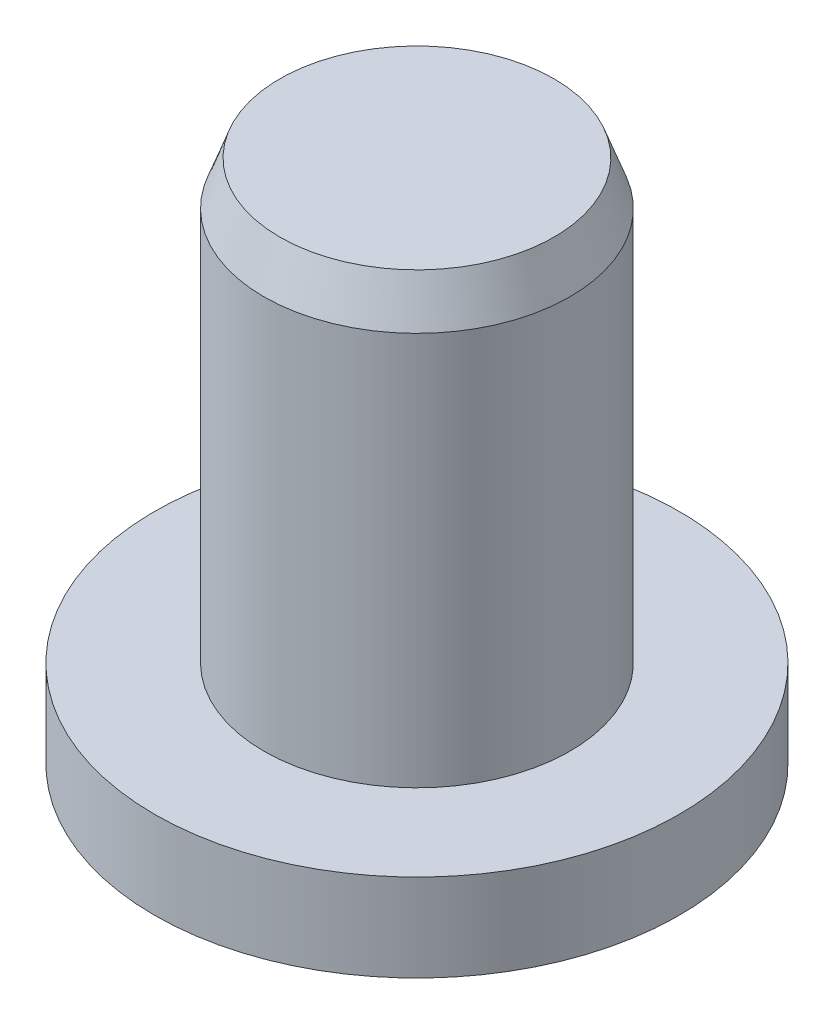
ISO-10303-21;
HEADER;
FILE_DESCRIPTION(('STEP AP214'),'2;1');
FILE_NAME('part.step','',(''),(''),'','','');
FILE_SCHEMA(('AUTOMOTIVE_DESIGN { 1 0 10303 214 1 1 1 1 }'));
ENDSEC;
DATA;
#1=APPLICATION_CONTEXT('core data for automotive mechanical design processes');
#2=APPLICATION_PROTOCOL_DEFINITION('international standard','automotive_design',2000,#1);
#3=PRODUCT_CONTEXT('',#1,'mechanical');
#4=PRODUCT('Part','Part','',(#3));
#5=PRODUCT_RELATED_PRODUCT_CATEGORY('part','',(#4));
#6=PRODUCT_DEFINITION_FORMATION('','',#4);
#7=PRODUCT_DEFINITION_CONTEXT('part definition',#1,'design');
#8=PRODUCT_DEFINITION('design','',#6,#7);
#9=PRODUCT_DEFINITION_SHAPE('','',#8);
#10=(LENGTH_UNIT() NAMED_UNIT(*) SI_UNIT(.MILLI.,.METRE.));
#11=(NAMED_UNIT(*) PLANE_ANGLE_UNIT() SI_UNIT($,.RADIAN.));
#12=(NAMED_UNIT(*) SI_UNIT($,.STERADIAN.) SOLID_ANGLE_UNIT());
#13=UNCERTAINTY_MEASURE_WITH_UNIT(LENGTH_MEASURE(1.E-05),#10,'distance_accuracy_value','');
#14=(GEOMETRIC_REPRESENTATION_CONTEXT(3) GLOBAL_UNCERTAINTY_ASSIGNED_CONTEXT((#13)) GLOBAL_UNIT_ASSIGNED_CONTEXT((#10,
#11,#12)) REPRESENTATION_CONTEXT('',''));
#15=CARTESIAN_POINT('',(0.,0.,0.));
#16=DIRECTION('',(0.,0.,1.));
#17=DIRECTION('',(1.,0.,0.));
#18=AXIS2_PLACEMENT_3D('',#15,#16,#17);
#19=CARTESIAN_POINT('',(0.,2.,0.));
#20=DIRECTION('',(0.,-1.,0.));
#21=DIRECTION('',(0.,0.,-1.));
#22=AXIS2_PLACEMENT_3D('',#19,#20,#21);
#23=CYLINDRICAL_SURFACE('',#22,6.);
#24=CARTESIAN_POINT('',(0.,2.,0.));
#25=DIRECTION('',(0.,1.,0.));
#26=DIRECTION('',(0.,0.,1.));
#27=AXIS2_PLACEMENT_3D('',#24,#25,#26);
#28=CIRCLE('',#27,6.);
#29=CARTESIAN_POINT('',(0.,2.,6.));
#30=VERTEX_POINT('',#29);
#31=EDGE_CURVE('E43',#30,#30,#28,.T.);
#32=ORIENTED_EDGE('',*,*,#31,.F.);
#33=EDGE_LOOP('',(#32));
#34=FACE_BOUND('',#33,.T.);
#35=CARTESIAN_POINT('',(0.,0.,0.));
#36=DIRECTION('',(0.,1.,0.));
#37=DIRECTION('',(0.,0.,1.));
#38=AXIS2_PLACEMENT_3D('',#35,#36,#37);
#39=CIRCLE('',#38,6.);
#40=CARTESIAN_POINT('',(0.,0.,6.));
#41=VERTEX_POINT('',#40);
#42=EDGE_CURVE('E47',#41,#41,#39,.T.);
#43=ORIENTED_EDGE('',*,*,#42,.T.);
#44=EDGE_LOOP('',(#43));
#45=FACE_BOUND('',#44,.T.);
#46=ADVANCED_FACE('F32',(#34,#45),#23,.T.);
#47=CARTESIAN_POINT('',(0.,2.,0.));
#48=DIRECTION('',(0.,1.,0.));
#49=DIRECTION('',(0.,0.,1.));
#50=AXIS2_PLACEMENT_3D('',#47,#48,#49);
#51=PLANE('',#50);
#52=CARTESIAN_POINT('',(0.,2.,0.));
#53=DIRECTION('',(0.,1.,0.));
#54=DIRECTION('',(0.,0.,1.));
#55=AXIS2_PLACEMENT_3D('',#52,#53,#54);
#56=CIRCLE('',#55,3.5);
#57=CARTESIAN_POINT('',(0.,2.,3.5));
#58=VERTEX_POINT('',#57);
#59=EDGE_CURVE('E51',#58,#58,#56,.T.);
#60=ORIENTED_EDGE('',*,*,#59,.F.);
#61=EDGE_LOOP('',(#60));
#62=FACE_BOUND('',#61,.T.);
#63=ORIENTED_EDGE('',*,*,#31,.T.);
#64=EDGE_LOOP('',(#63));
#65=FACE_BOUND('',#64,.T.);
#66=ADVANCED_FACE('F58',(#62,#65),#51,.T.);
#67=CARTESIAN_POINT('',(0.,0.,0.));
#68=DIRECTION('',(0.,1.,0.));
#69=DIRECTION('',(0.,0.,1.));
#70=AXIS2_PLACEMENT_3D('',#67,#68,#69);
#71=PLANE('',#70);
#72=ORIENTED_EDGE('',*,*,#42,.F.);
#73=EDGE_LOOP('',(#72));
#74=FACE_BOUND('',#73,.T.);
#75=ADVANCED_FACE('F61',(#74),#71,.F.);
#76=CARTESIAN_POINT('',(0.,12.,0.));
#77=DIRECTION('',(0.,-1.,0.));
#78=DIRECTION('',(0.,0.,-1.));
#79=AXIS2_PLACEMENT_3D('',#76,#77,#78);
#80=CYLINDRICAL_SURFACE('',#79,3.5);
#81=CARTESIAN_POINT('',(0.,11.,0.));
#82=DIRECTION('',(0.,1.,0.));
#83=DIRECTION('',(0.,0.,1.));
#84=AXIS2_PLACEMENT_3D('',#81,#82,#83);
#85=CIRCLE('',#84,3.5);
#86=CARTESIAN_POINT('',(0.,11.,3.5));
#87=VERTEX_POINT('',#86);
#88=EDGE_CURVE('E10',#87,#87,#85,.F.);
#89=ORIENTED_EDGE('',*,*,#88,.T.);
#90=EDGE_LOOP('',(#89));
#91=FACE_BOUND('',#90,.T.);
#92=ORIENTED_EDGE('',*,*,#59,.T.);
#93=EDGE_LOOP('',(#92));
#94=FACE_BOUND('',#93,.T.);
#95=ADVANCED_FACE('F56',(#91,#94),#80,.T.);
#96=CARTESIAN_POINT('',(0.,12.,0.));
#97=DIRECTION('',(0.,1.,0.));
#98=DIRECTION('',(0.,0.,1.));
#99=AXIS2_PLACEMENT_3D('',#96,#97,#98);
#100=PLANE('',#99);
#101=CARTESIAN_POINT('',(0.,12.,0.));
#102=DIRECTION('',(0.,1.,0.));
#103=DIRECTION('',(0.,0.,1.));
#104=AXIS2_PLACEMENT_3D('',#101,#102,#103);
#105=CIRCLE('',#104,3.1360297657338);
#106=CARTESIAN_POINT('',(0.,12.,3.1360297657338));
#107=VERTEX_POINT('',#106);
#108=EDGE_CURVE('E39',#107,#107,#105,.T.);
#109=ORIENTED_EDGE('',*,*,#108,.T.);
#110=EDGE_LOOP('',(#109));
#111=FACE_BOUND('',#110,.T.);
#112=ADVANCED_FACE('F74',(#111),#100,.T.);
#113=CARTESIAN_POINT('',(0.,12.,0.));
#114=DIRECTION('',(0.,-1.,0.));
#115=DIRECTION('',(0.,0.,-1.));
#116=AXIS2_PLACEMENT_3D('',#113,#114,#115);
#117=CONICAL_SURFACE('',#116,3.1360297657338,0.349065850398863);
#118=ORIENTED_EDGE('',*,*,#88,.F.);
#119=EDGE_LOOP('',(#118));
#120=FACE_BOUND('',#119,.T.);
#121=ORIENTED_EDGE('',*,*,#108,.F.);
#122=EDGE_LOOP('',(#121));
#123=FACE_BOUND('',#122,.T.);
#124=ADVANCED_FACE('F34',(#120,#123),#117,.T.);
#125=CLOSED_SHELL('',(#46,#66,#75,#95,#112,#124));
#126=MANIFOLD_SOLID_BREP('B2',#125);
#127=ADVANCED_BREP_SHAPE_REPRESENTATION('',(#18,#126),#14);
#128=SHAPE_DEFINITION_REPRESENTATION(#9,#127);
ENDSEC;
END-ISO-10303-21;
